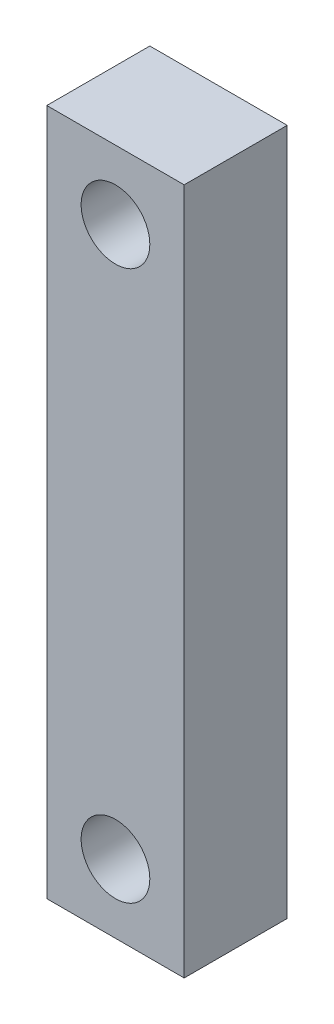
ISO-10303-21;
HEADER;
FILE_DESCRIPTION(('STEP AP214'),'2;1');
FILE_NAME('part.step','',(''),(''),'','','');
FILE_SCHEMA(('AUTOMOTIVE_DESIGN { 1 0 10303 214 1 1 1 1 }'));
ENDSEC;
DATA;
#1=APPLICATION_CONTEXT('core data for automotive mechanical design processes');
#2=APPLICATION_PROTOCOL_DEFINITION('international standard','automotive_design',2000,#1);
#3=PRODUCT_CONTEXT('',#1,'mechanical');
#4=PRODUCT('Part','Part','',(#3));
#5=PRODUCT_RELATED_PRODUCT_CATEGORY('part','',(#4));
#6=PRODUCT_DEFINITION_FORMATION('','',#4);
#7=PRODUCT_DEFINITION_CONTEXT('part definition',#1,'design');
#8=PRODUCT_DEFINITION('design','',#6,#7);
#9=PRODUCT_DEFINITION_SHAPE('','',#8);
#10=(LENGTH_UNIT() NAMED_UNIT(*) SI_UNIT(.MILLI.,.METRE.));
#11=(NAMED_UNIT(*) PLANE_ANGLE_UNIT() SI_UNIT($,.RADIAN.));
#12=(NAMED_UNIT(*) SI_UNIT($,.STERADIAN.) SOLID_ANGLE_UNIT());
#13=UNCERTAINTY_MEASURE_WITH_UNIT(LENGTH_MEASURE(1.E-05),#10,'distance_accuracy_value','');
#14=(GEOMETRIC_REPRESENTATION_CONTEXT(3) GLOBAL_UNCERTAINTY_ASSIGNED_CONTEXT((#13)) GLOBAL_UNIT_ASSIGNED_CONTEXT((#10,
#11,#12)) REPRESENTATION_CONTEXT('',''));
#15=CARTESIAN_POINT('',(0.,0.,0.));
#16=DIRECTION('',(0.,0.,1.));
#17=DIRECTION('',(1.,0.,0.));
#18=AXIS2_PLACEMENT_3D('',#15,#16,#17);
#19=CARTESIAN_POINT('',(10.,50.,15.));
#20=DIRECTION('',(-1.,0.,0.));
#21=DIRECTION('',(0.,-1.,0.));
#22=AXIS2_PLACEMENT_3D('',#19,#20,#21);
#23=PLANE('',#22);
#24=DIRECTION('',(0.,1.,0.));
#25=VECTOR('',#24,1.);
#26=CARTESIAN_POINT('',(10.,50.,0.));
#27=LINE('',#26,#25);
#28=CARTESIAN_POINT('',(10.,-50.,0.));
#29=VERTEX_POINT('',#28);
#30=CARTESIAN_POINT('',(10.,50.,0.));
#31=VERTEX_POINT('',#30);
#32=EDGE_CURVE('E97',#29,#31,#27,.T.);
#33=ORIENTED_EDGE('',*,*,#32,.T.);
#34=DIRECTION('',(0.,0.,-1.));
#35=VECTOR('',#34,1.);
#36=CARTESIAN_POINT('',(10.,50.,15.));
#37=LINE('',#36,#35);
#38=CARTESIAN_POINT('',(10.,50.,15.));
#39=VERTEX_POINT('',#38);
#40=EDGE_CURVE('E11',#39,#31,#37,.T.);
#41=ORIENTED_EDGE('',*,*,#40,.F.);
#42=DIRECTION('',(0.,1.,0.));
#43=VECTOR('',#42,1.);
#44=CARTESIAN_POINT('',(10.,50.,15.));
#45=LINE('',#44,#43);
#46=CARTESIAN_POINT('',(10.,-50.,15.));
#47=VERTEX_POINT('',#46);
#48=EDGE_CURVE('E85',#47,#39,#45,.T.);
#49=ORIENTED_EDGE('',*,*,#48,.F.);
#50=DIRECTION('',(0.,0.,-1.));
#51=VECTOR('',#50,1.);
#52=CARTESIAN_POINT('',(10.,-50.,15.));
#53=LINE('',#52,#51);
#54=EDGE_CURVE('E93',#47,#29,#53,.T.);
#55=ORIENTED_EDGE('',*,*,#54,.T.);
#56=EDGE_LOOP('',(#33,#41,#49,#55));
#57=FACE_BOUND('',#56,.T.);
#58=ADVANCED_FACE('F34',(#57),#23,.F.);
#59=CARTESIAN_POINT('',(-10.,50.,15.));
#60=DIRECTION('',(0.,-1.,0.));
#61=DIRECTION('',(0.,0.,-1.));
#62=AXIS2_PLACEMENT_3D('',#59,#60,#61);
#63=PLANE('',#62);
#64=DIRECTION('',(-1.,0.,0.));
#65=VECTOR('',#64,1.);
#66=CARTESIAN_POINT('',(-10.,50.,0.));
#67=LINE('',#66,#65);
#68=CARTESIAN_POINT('',(-10.,50.,0.));
#69=VERTEX_POINT('',#68);
#70=EDGE_CURVE('E89',#31,#69,#67,.T.);
#71=ORIENTED_EDGE('',*,*,#70,.T.);
#72=DIRECTION('',(0.,0.,-1.));
#73=VECTOR('',#72,1.);
#74=CARTESIAN_POINT('',(-10.,50.,15.));
#75=LINE('',#74,#73);
#76=CARTESIAN_POINT('',(-10.,50.,15.));
#77=VERTEX_POINT('',#76);
#78=EDGE_CURVE('E42',#77,#69,#75,.T.);
#79=ORIENTED_EDGE('',*,*,#78,.F.);
#80=DIRECTION('',(-1.,0.,0.));
#81=VECTOR('',#80,1.);
#82=CARTESIAN_POINT('',(-10.,50.,15.));
#83=LINE('',#82,#81);
#84=EDGE_CURVE('E80',#39,#77,#83,.T.);
#85=ORIENTED_EDGE('',*,*,#84,.F.);
#86=ORIENTED_EDGE('',*,*,#40,.T.);
#87=EDGE_LOOP('',(#71,#79,#85,#86));
#88=FACE_BOUND('',#87,.T.);
#89=ADVANCED_FACE('F88',(#88),#63,.F.);
#90=CARTESIAN_POINT('',(-10.,50.,15.));
#91=DIRECTION('',(1.,0.,0.));
#92=DIRECTION('',(0.,1.,0.));
#93=AXIS2_PLACEMENT_3D('',#90,#91,#92);
#94=PLANE('',#93);
#95=DIRECTION('',(0.,-1.,0.));
#96=VECTOR('',#95,1.);
#97=CARTESIAN_POINT('',(-10.,50.,0.));
#98=LINE('',#97,#96);
#99=CARTESIAN_POINT('',(-9.99999999999999,-50.,0.));
#100=VERTEX_POINT('',#99);
#101=EDGE_CURVE('E67',#69,#100,#98,.T.);
#102=ORIENTED_EDGE('',*,*,#101,.T.);
#103=DIRECTION('',(0.,0.,-1.));
#104=VECTOR('',#103,1.);
#105=CARTESIAN_POINT('',(-9.99999999999999,-50.,15.));
#106=LINE('',#105,#104);
#107=CARTESIAN_POINT('',(-9.99999999999999,-50.,15.));
#108=VERTEX_POINT('',#107);
#109=EDGE_CURVE('E90',#108,#100,#106,.T.);
#110=ORIENTED_EDGE('',*,*,#109,.F.);
#111=DIRECTION('',(0.,-1.,0.));
#112=VECTOR('',#111,1.);
#113=CARTESIAN_POINT('',(-10.,50.,15.));
#114=LINE('',#113,#112);
#115=EDGE_CURVE('E83',#77,#108,#114,.T.);
#116=ORIENTED_EDGE('',*,*,#115,.F.);
#117=ORIENTED_EDGE('',*,*,#78,.T.);
#118=EDGE_LOOP('',(#102,#110,#116,#117));
#119=FACE_BOUND('',#118,.T.);
#120=ADVANCED_FACE('F91',(#119),#94,.F.);
#121=CARTESIAN_POINT('',(-9.99999999999999,-50.,15.));
#122=DIRECTION('',(0.,1.,0.));
#123=DIRECTION('',(0.,0.,1.));
#124=AXIS2_PLACEMENT_3D('',#121,#122,#123);
#125=PLANE('',#124);
#126=DIRECTION('',(1.,0.,0.));
#127=VECTOR('',#126,1.);
#128=CARTESIAN_POINT('',(-9.99999999999999,-50.,0.));
#129=LINE('',#128,#127);
#130=EDGE_CURVE('E73',#100,#29,#129,.T.);
#131=ORIENTED_EDGE('',*,*,#130,.T.);
#132=ORIENTED_EDGE('',*,*,#54,.F.);
#133=DIRECTION('',(1.,0.,0.));
#134=VECTOR('',#133,1.);
#135=CARTESIAN_POINT('',(-9.99999999999999,-50.,15.));
#136=LINE('',#135,#134);
#137=EDGE_CURVE('E50',#108,#47,#136,.T.);
#138=ORIENTED_EDGE('',*,*,#137,.F.);
#139=ORIENTED_EDGE('',*,*,#109,.T.);
#140=EDGE_LOOP('',(#131,#132,#138,#139));
#141=FACE_BOUND('',#140,.T.);
#142=ADVANCED_FACE('F105',(#141),#125,.F.);
#143=CARTESIAN_POINT('',(0.,0.,15.));
#144=DIRECTION('',(0.,0.,1.));
#145=DIRECTION('',(1.,0.,0.));
#146=AXIS2_PLACEMENT_3D('',#143,#144,#145);
#147=PLANE('',#146);
#148=CARTESIAN_POINT('',(0.,40.,15.));
#149=DIRECTION('',(0.,0.,1.));
#150=DIRECTION('',(1.,0.,0.));
#151=AXIS2_PLACEMENT_3D('',#148,#149,#150);
#152=CIRCLE('',#151,5.);
#153=CARTESIAN_POINT('',(5.,40.,15.));
#154=VERTEX_POINT('',#153);
#155=EDGE_CURVE('E117',#154,#154,#152,.T.);
#156=ORIENTED_EDGE('',*,*,#155,.F.);
#157=EDGE_LOOP('',(#156));
#158=FACE_BOUND('',#157,.T.);
#159=CARTESIAN_POINT('',(0.,-40.,15.));
#160=DIRECTION('',(0.,0.,1.));
#161=DIRECTION('',(1.,0.,0.));
#162=AXIS2_PLACEMENT_3D('',#159,#160,#161);
#163=CIRCLE('',#162,5.);
#164=CARTESIAN_POINT('',(5.,-40.,15.));
#165=VERTEX_POINT('',#164);
#166=EDGE_CURVE('E111',#165,#165,#163,.T.);
#167=ORIENTED_EDGE('',*,*,#166,.F.);
#168=EDGE_LOOP('',(#167));
#169=FACE_BOUND('',#168,.T.);
#170=ORIENTED_EDGE('',*,*,#48,.T.);
#171=ORIENTED_EDGE('',*,*,#84,.T.);
#172=ORIENTED_EDGE('',*,*,#115,.T.);
#173=ORIENTED_EDGE('',*,*,#137,.T.);
#174=EDGE_LOOP('',(#170,#171,#172,#173));
#175=FACE_BOUND('',#174,.T.);
#176=ADVANCED_FACE('F81',(#158,#169,#175),#147,.T.);
#177=CARTESIAN_POINT('',(0.,0.,0.));
#178=DIRECTION('',(0.,0.,1.));
#179=DIRECTION('',(1.,0.,0.));
#180=AXIS2_PLACEMENT_3D('',#177,#178,#179);
#181=PLANE('',#180);
#182=CARTESIAN_POINT('',(0.,40.,0.));
#183=DIRECTION('',(0.,0.,1.));
#184=DIRECTION('',(1.,0.,0.));
#185=AXIS2_PLACEMENT_3D('',#182,#183,#184);
#186=CIRCLE('',#185,5.);
#187=CARTESIAN_POINT('',(5.,40.,0.));
#188=VERTEX_POINT('',#187);
#189=EDGE_CURVE('E100',#188,#188,#186,.T.);
#190=ORIENTED_EDGE('',*,*,#189,.T.);
#191=EDGE_LOOP('',(#190));
#192=FACE_BOUND('',#191,.T.);
#193=CARTESIAN_POINT('',(0.,-40.,0.));
#194=DIRECTION('',(0.,0.,1.));
#195=DIRECTION('',(1.,0.,0.));
#196=AXIS2_PLACEMENT_3D('',#193,#194,#195);
#197=CIRCLE('',#196,5.);
#198=CARTESIAN_POINT('',(5.,-40.,0.));
#199=VERTEX_POINT('',#198);
#200=EDGE_CURVE('E114',#199,#199,#197,.T.);
#201=ORIENTED_EDGE('',*,*,#200,.T.);
#202=EDGE_LOOP('',(#201));
#203=FACE_BOUND('',#202,.T.);
#204=ORIENTED_EDGE('',*,*,#32,.F.);
#205=ORIENTED_EDGE('',*,*,#130,.F.);
#206=ORIENTED_EDGE('',*,*,#101,.F.);
#207=ORIENTED_EDGE('',*,*,#70,.F.);
#208=EDGE_LOOP('',(#204,#205,#206,#207));
#209=FACE_BOUND('',#208,.T.);
#210=ADVANCED_FACE('F108',(#192,#203,#209),#181,.F.);
#211=CARTESIAN_POINT('',(0.,-40.,0.));
#212=DIRECTION('',(0.,0.,1.));
#213=DIRECTION('',(1.,0.,0.));
#214=AXIS2_PLACEMENT_3D('',#211,#212,#213);
#215=CYLINDRICAL_SURFACE('',#214,5.);
#216=ORIENTED_EDGE('',*,*,#200,.F.);
#217=EDGE_LOOP('',(#216));
#218=FACE_BOUND('',#217,.T.);
#219=ORIENTED_EDGE('',*,*,#166,.T.);
#220=EDGE_LOOP('',(#219));
#221=FACE_BOUND('',#220,.T.);
#222=ADVANCED_FACE('F128',(#218,#221),#215,.F.);
#223=CARTESIAN_POINT('',(0.,40.,0.));
#224=DIRECTION('',(0.,0.,1.));
#225=DIRECTION('',(1.,0.,0.));
#226=AXIS2_PLACEMENT_3D('',#223,#224,#225);
#227=CYLINDRICAL_SURFACE('',#226,5.);
#228=ORIENTED_EDGE('',*,*,#189,.F.);
#229=EDGE_LOOP('',(#228));
#230=FACE_BOUND('',#229,.T.);
#231=ORIENTED_EDGE('',*,*,#155,.T.);
#232=EDGE_LOOP('',(#231));
#233=FACE_BOUND('',#232,.T.);
#234=ADVANCED_FACE('F125',(#230,#233),#227,.F.);
#235=CLOSED_SHELL('',(#58,#89,#120,#142,#176,#210,#222,#234));
#236=MANIFOLD_SOLID_BREP('B2',#235);
#237=ADVANCED_BREP_SHAPE_REPRESENTATION('',(#18,#236),#14);
#238=SHAPE_DEFINITION_REPRESENTATION(#9,#237);
ENDSEC;
END-ISO-10303-21;
